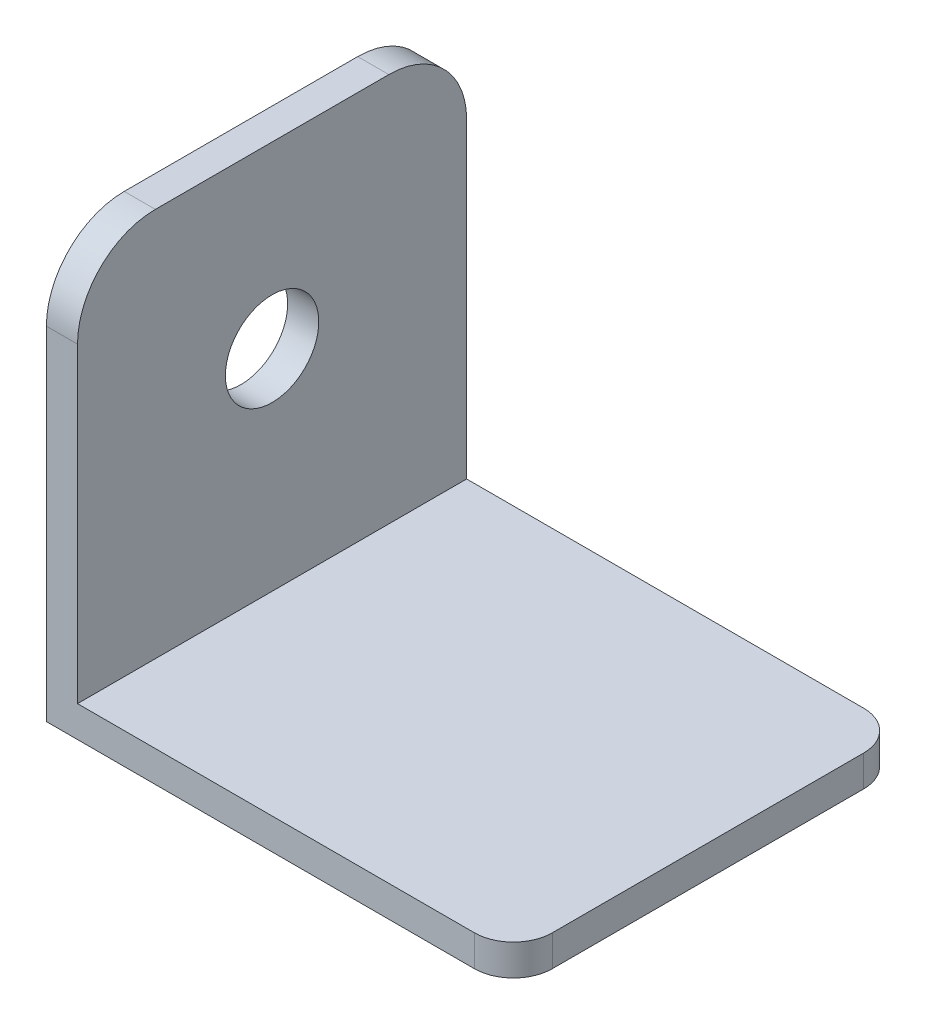
ISO-10303-21;
HEADER;
FILE_DESCRIPTION(('STEP AP214'),'2;1');
FILE_NAME('part.step','',(''),(''),'','','');
FILE_SCHEMA(('AUTOMOTIVE_DESIGN { 1 0 10303 214 1 1 1 1 }'));
ENDSEC;
DATA;
#1=APPLICATION_CONTEXT('core data for automotive mechanical design processes');
#2=APPLICATION_PROTOCOL_DEFINITION('international standard','automotive_design',2000,#1);
#3=PRODUCT_CONTEXT('',#1,'mechanical');
#4=PRODUCT('Part','Part','',(#3));
#5=PRODUCT_RELATED_PRODUCT_CATEGORY('part','',(#4));
#6=PRODUCT_DEFINITION_FORMATION('','',#4);
#7=PRODUCT_DEFINITION_CONTEXT('part definition',#1,'design');
#8=PRODUCT_DEFINITION('design','',#6,#7);
#9=PRODUCT_DEFINITION_SHAPE('','',#8);
#10=(LENGTH_UNIT() NAMED_UNIT(*) SI_UNIT(.MILLI.,.METRE.));
#11=(NAMED_UNIT(*) PLANE_ANGLE_UNIT() SI_UNIT($,.RADIAN.));
#12=(NAMED_UNIT(*) SI_UNIT($,.STERADIAN.) SOLID_ANGLE_UNIT());
#13=UNCERTAINTY_MEASURE_WITH_UNIT(LENGTH_MEASURE(1.E-05),#10,'distance_accuracy_value','');
#14=(GEOMETRIC_REPRESENTATION_CONTEXT(3) GLOBAL_UNCERTAINTY_ASSIGNED_CONTEXT((#13)) GLOBAL_UNIT_ASSIGNED_CONTEXT((#10,
#11,#12)) REPRESENTATION_CONTEXT('',''));
#15=CARTESIAN_POINT('',(0.,0.,0.));
#16=DIRECTION('',(0.,0.,1.));
#17=DIRECTION('',(1.,0.,0.));
#18=AXIS2_PLACEMENT_3D('',#15,#16,#17);
#19=CARTESIAN_POINT('',(0.,4.,0.));
#20=DIRECTION('',(0.,1.,0.));
#21=DIRECTION('',(0.,0.,1.));
#22=AXIS2_PLACEMENT_3D('',#19,#20,#21);
#23=PLANE('',#22);
#24=DIRECTION('',(0.,0.,-1.));
#25=VECTOR('',#24,1.);
#26=CARTESIAN_POINT('',(30.,4.,-25.));
#27=LINE('',#26,#25);
#28=CARTESIAN_POINT('',(30.,4.,20.));
#29=VERTEX_POINT('',#28);
#30=CARTESIAN_POINT('',(30.,4.,-20.));
#31=VERTEX_POINT('',#30);
#32=EDGE_CURVE('E132',#29,#31,#27,.T.);
#33=ORIENTED_EDGE('',*,*,#32,.T.);
#34=CARTESIAN_POINT('',(25.,4.,-20.));
#35=DIRECTION('',(0.,1.,0.));
#36=DIRECTION('',(0.,0.,1.));
#37=AXIS2_PLACEMENT_3D('',#34,#35,#36);
#38=CIRCLE('',#37,5.);
#39=CARTESIAN_POINT('',(25.,4.,-25.));
#40=VERTEX_POINT('',#39);
#41=EDGE_CURVE('E51',#31,#40,#38,.T.);
#42=ORIENTED_EDGE('',*,*,#41,.T.);
#43=DIRECTION('',(-1.,0.,0.));
#44=VECTOR('',#43,1.);
#45=CARTESIAN_POINT('',(-30.,4.,-25.));
#46=LINE('',#45,#44);
#47=CARTESIAN_POINT('',(-26.,4.,-25.));
#48=VERTEX_POINT('',#47);
#49=EDGE_CURVE('E122',#40,#48,#46,.T.);
#50=ORIENTED_EDGE('',*,*,#49,.T.);
#51=DIRECTION('',(0.,0.,1.));
#52=VECTOR('',#51,1.);
#53=CARTESIAN_POINT('',(-26.,4.,-25.));
#54=LINE('',#53,#52);
#55=CARTESIAN_POINT('',(-26.,4.,25.));
#56=VERTEX_POINT('',#55);
#57=EDGE_CURVE('E124',#48,#56,#54,.T.);
#58=ORIENTED_EDGE('',*,*,#57,.T.);
#59=DIRECTION('',(1.,0.,0.));
#60=VECTOR('',#59,1.);
#61=CARTESIAN_POINT('',(-30.,4.,25.));
#62=LINE('',#61,#60);
#63=CARTESIAN_POINT('',(25.,4.,25.));
#64=VERTEX_POINT('',#63);
#65=EDGE_CURVE('E131',#56,#64,#62,.T.);
#66=ORIENTED_EDGE('',*,*,#65,.T.);
#67=CARTESIAN_POINT('',(25.,4.,20.));
#68=DIRECTION('',(0.,1.,0.));
#69=DIRECTION('',(0.,0.,1.));
#70=AXIS2_PLACEMENT_3D('',#67,#68,#69);
#71=CIRCLE('',#70,5.);
#72=EDGE_CURVE('E231',#64,#29,#71,.T.);
#73=ORIENTED_EDGE('',*,*,#72,.T.);
#74=EDGE_LOOP('',(#33,#42,#50,#58,#66,#73));
#75=FACE_BOUND('',#74,.T.);
#76=ADVANCED_FACE('F42',(#75),#23,.T.);
#77=CARTESIAN_POINT('',(30.,4.,-25.));
#78=DIRECTION('',(-1.,0.,0.));
#79=DIRECTION('',(0.,0.,1.));
#80=AXIS2_PLACEMENT_3D('',#77,#78,#79);
#81=PLANE('',#80);
#82=DIRECTION('',(0.,0.,-1.));
#83=VECTOR('',#82,1.);
#84=CARTESIAN_POINT('',(30.,0.,-25.));
#85=LINE('',#84,#83);
#86=CARTESIAN_POINT('',(30.,0.,20.));
#87=VERTEX_POINT('',#86);
#88=CARTESIAN_POINT('',(30.,0.,-20.));
#89=VERTEX_POINT('',#88);
#90=EDGE_CURVE('E184',#87,#89,#85,.T.);
#91=ORIENTED_EDGE('',*,*,#90,.T.);
#92=DIRECTION('',(0.,-1.,0.));
#93=VECTOR('',#92,1.);
#94=CARTESIAN_POINT('',(30.,4.,-20.));
#95=LINE('',#94,#93);
#96=EDGE_CURVE('E64',#89,#31,#95,.F.);
#97=ORIENTED_EDGE('',*,*,#96,.T.);
#98=ORIENTED_EDGE('',*,*,#32,.F.);
#99=DIRECTION('',(0.,-1.,0.));
#100=VECTOR('',#99,1.);
#101=CARTESIAN_POINT('',(30.,4.,20.));
#102=LINE('',#101,#100);
#103=EDGE_CURVE('E225',#29,#87,#102,.T.);
#104=ORIENTED_EDGE('',*,*,#103,.T.);
#105=EDGE_LOOP('',(#91,#97,#98,#104));
#106=FACE_BOUND('',#105,.T.);
#107=ADVANCED_FACE('F253',(#106),#81,.F.);
#108=CARTESIAN_POINT('',(-30.,4.,-25.));
#109=DIRECTION('',(0.,0.,1.));
#110=DIRECTION('',(1.,0.,0.));
#111=AXIS2_PLACEMENT_3D('',#108,#109,#110);
#112=PLANE('',#111);
#113=ORIENTED_EDGE('',*,*,#49,.F.);
#114=DIRECTION('',(0.,-1.,0.));
#115=VECTOR('',#114,1.);
#116=CARTESIAN_POINT('',(25.,4.,-25.));
#117=LINE('',#116,#115);
#118=CARTESIAN_POINT('',(25.,0.,-25.));
#119=VERTEX_POINT('',#118);
#120=EDGE_CURVE('E216',#40,#119,#117,.T.);
#121=ORIENTED_EDGE('',*,*,#120,.T.);
#122=DIRECTION('',(-1.,0.,0.));
#123=VECTOR('',#122,1.);
#124=CARTESIAN_POINT('',(-30.,0.,-25.));
#125=LINE('',#124,#123);
#126=CARTESIAN_POINT('',(-30.,0.,-25.));
#127=VERTEX_POINT('',#126);
#128=EDGE_CURVE('E201',#119,#127,#125,.T.);
#129=ORIENTED_EDGE('',*,*,#128,.T.);
#130=DIRECTION('',(0.,-1.,0.));
#131=VECTOR('',#130,1.);
#132=CARTESIAN_POINT('',(-30.,4.,-25.));
#133=LINE('',#132,#131);
#134=CARTESIAN_POINT('',(-30.,44.,-25.));
#135=VERTEX_POINT('',#134);
#136=EDGE_CURVE('E212',#135,#127,#133,.T.);
#137=ORIENTED_EDGE('',*,*,#136,.F.);
#138=DIRECTION('',(-1.,0.,0.));
#139=VECTOR('',#138,1.);
#140=CARTESIAN_POINT('',(-26.,44.,-25.));
#141=LINE('',#140,#139);
#142=CARTESIAN_POINT('',(-26.,44.,-25.));
#143=VERTEX_POINT('',#142);
#144=EDGE_CURVE('E147',#143,#135,#141,.T.);
#145=ORIENTED_EDGE('',*,*,#144,.F.);
#146=DIRECTION('',(0.,-1.,0.));
#147=VECTOR('',#146,1.);
#148=CARTESIAN_POINT('',(-26.,4.,-25.));
#149=LINE('',#148,#147);
#150=EDGE_CURVE('E138',#143,#48,#149,.T.);
#151=ORIENTED_EDGE('',*,*,#150,.T.);
#152=EDGE_LOOP('',(#113,#121,#129,#137,#145,#151));
#153=FACE_BOUND('',#152,.T.);
#154=ADVANCED_FACE('F145',(#153),#112,.F.);
#155=CARTESIAN_POINT('',(-30.,4.,-25.));
#156=DIRECTION('',(1.,0.,0.));
#157=DIRECTION('',(0.,0.,-1.));
#158=AXIS2_PLACEMENT_3D('',#155,#156,#157);
#159=PLANE('',#158);
#160=DIRECTION('',(0.,0.,1.));
#161=VECTOR('',#160,1.);
#162=CARTESIAN_POINT('',(-30.,0.,-25.));
#163=LINE('',#162,#161);
#164=CARTESIAN_POINT('',(-30.,0.,25.));
#165=VERTEX_POINT('',#164);
#166=EDGE_CURVE('E204',#127,#165,#163,.T.);
#167=ORIENTED_EDGE('',*,*,#166,.T.);
#168=DIRECTION('',(0.,-1.,0.));
#169=VECTOR('',#168,1.);
#170=CARTESIAN_POINT('',(-30.,4.,25.));
#171=LINE('',#170,#169);
#172=CARTESIAN_POINT('',(-30.,44.,25.));
#173=VERTEX_POINT('',#172);
#174=EDGE_CURVE('E198',#173,#165,#171,.T.);
#175=ORIENTED_EDGE('',*,*,#174,.F.);
#176=CARTESIAN_POINT('',(-30.,44.,15.));
#177=DIRECTION('',(-1.,0.,0.));
#178=DIRECTION('',(0.,0.,-1.));
#179=AXIS2_PLACEMENT_3D('',#176,#177,#178);
#180=CIRCLE('',#179,10.);
#181=CARTESIAN_POINT('',(-30.,54.,15.));
#182=VERTEX_POINT('',#181);
#183=EDGE_CURVE('E174',#173,#182,#180,.T.);
#184=ORIENTED_EDGE('',*,*,#183,.T.);
#185=DIRECTION('',(0.,0.,-1.));
#186=VECTOR('',#185,1.);
#187=CARTESIAN_POINT('',(-30.,54.,-15.));
#188=LINE('',#187,#186);
#189=CARTESIAN_POINT('',(-30.,54.,-15.));
#190=VERTEX_POINT('',#189);
#191=EDGE_CURVE('E154',#182,#190,#188,.T.);
#192=ORIENTED_EDGE('',*,*,#191,.T.);
#193=CARTESIAN_POINT('',(-30.,44.,-15.));
#194=DIRECTION('',(-1.,0.,0.));
#195=DIRECTION('',(0.,0.,-1.));
#196=AXIS2_PLACEMENT_3D('',#193,#194,#195);
#197=CIRCLE('',#196,10.);
#198=EDGE_CURVE('E149',#190,#135,#197,.T.);
#199=ORIENTED_EDGE('',*,*,#198,.T.);
#200=ORIENTED_EDGE('',*,*,#136,.T.);
#201=EDGE_LOOP('',(#167,#175,#184,#192,#199,#200));
#202=FACE_BOUND('',#201,.T.);
#203=CARTESIAN_POINT('',(-30.,31.,0.));
#204=DIRECTION('',(-1.,0.,0.));
#205=DIRECTION('',(0.,0.,1.));
#206=AXIS2_PLACEMENT_3D('',#203,#204,#205);
#207=CIRCLE('',#206,6.);
#208=CARTESIAN_POINT('',(-30.,31.,6.));
#209=VERTEX_POINT('',#208);
#210=EDGE_CURVE('E157',#209,#209,#207,.T.);
#211=ORIENTED_EDGE('',*,*,#210,.F.);
#212=EDGE_LOOP('',(#211));
#213=FACE_BOUND('',#212,.T.);
#214=ADVANCED_FACE('F242',(#202,#213),#159,.F.);
#215=CARTESIAN_POINT('',(-30.,4.,25.));
#216=DIRECTION('',(0.,0.,-1.));
#217=DIRECTION('',(-1.,0.,0.));
#218=AXIS2_PLACEMENT_3D('',#215,#216,#217);
#219=PLANE('',#218);
#220=DIRECTION('',(1.,0.,0.));
#221=VECTOR('',#220,1.);
#222=CARTESIAN_POINT('',(-30.,0.,25.));
#223=LINE('',#222,#221);
#224=CARTESIAN_POINT('',(25.,0.,25.));
#225=VERTEX_POINT('',#224);
#226=EDGE_CURVE('E194',#165,#225,#223,.T.);
#227=ORIENTED_EDGE('',*,*,#226,.T.);
#228=DIRECTION('',(0.,-1.,0.));
#229=VECTOR('',#228,1.);
#230=CARTESIAN_POINT('',(25.,4.,25.));
#231=LINE('',#230,#229);
#232=EDGE_CURVE('E11',#225,#64,#231,.F.);
#233=ORIENTED_EDGE('',*,*,#232,.T.);
#234=ORIENTED_EDGE('',*,*,#65,.F.);
#235=DIRECTION('',(0.,1.,0.));
#236=VECTOR('',#235,1.);
#237=CARTESIAN_POINT('',(-26.,44.,25.));
#238=LINE('',#237,#236);
#239=CARTESIAN_POINT('',(-26.,44.,25.));
#240=VERTEX_POINT('',#239);
#241=EDGE_CURVE('E142',#56,#240,#238,.T.);
#242=ORIENTED_EDGE('',*,*,#241,.T.);
#243=DIRECTION('',(-1.,0.,0.));
#244=VECTOR('',#243,1.);
#245=CARTESIAN_POINT('',(-26.,44.,25.));
#246=LINE('',#245,#244);
#247=EDGE_CURVE('E173',#240,#173,#246,.T.);
#248=ORIENTED_EDGE('',*,*,#247,.T.);
#249=ORIENTED_EDGE('',*,*,#174,.T.);
#250=EDGE_LOOP('',(#227,#233,#234,#242,#248,#249));
#251=FACE_BOUND('',#250,.T.);
#252=ADVANCED_FACE('F244',(#251),#219,.F.);
#253=CARTESIAN_POINT('',(0.,0.,0.));
#254=DIRECTION('',(0.,1.,0.));
#255=DIRECTION('',(0.,0.,1.));
#256=AXIS2_PLACEMENT_3D('',#253,#254,#255);
#257=PLANE('',#256);
#258=ORIENTED_EDGE('',*,*,#128,.F.);
#259=CARTESIAN_POINT('',(25.,0.,-20.));
#260=DIRECTION('',(0.,1.,0.));
#261=DIRECTION('',(0.,0.,1.));
#262=AXIS2_PLACEMENT_3D('',#259,#260,#261);
#263=CIRCLE('',#262,5.);
#264=EDGE_CURVE('E222',#119,#89,#263,.F.);
#265=ORIENTED_EDGE('',*,*,#264,.T.);
#266=ORIENTED_EDGE('',*,*,#90,.F.);
#267=CARTESIAN_POINT('',(25.,0.,20.));
#268=DIRECTION('',(0.,1.,0.));
#269=DIRECTION('',(0.,0.,1.));
#270=AXIS2_PLACEMENT_3D('',#267,#268,#269);
#271=CIRCLE('',#270,5.);
#272=EDGE_CURVE('E219',#87,#225,#271,.F.);
#273=ORIENTED_EDGE('',*,*,#272,.T.);
#274=ORIENTED_EDGE('',*,*,#226,.F.);
#275=ORIENTED_EDGE('',*,*,#166,.F.);
#276=EDGE_LOOP('',(#258,#265,#266,#273,#274,#275));
#277=FACE_BOUND('',#276,.T.);
#278=ADVANCED_FACE('F251',(#277),#257,.F.);
#279=CARTESIAN_POINT('',(-26.,44.,-15.));
#280=DIRECTION('',(-1.,0.,0.));
#281=DIRECTION('',(0.,0.,1.));
#282=AXIS2_PLACEMENT_3D('',#279,#280,#281);
#283=CYLINDRICAL_SURFACE('',#282,10.);
#284=ORIENTED_EDGE('',*,*,#198,.F.);
#285=DIRECTION('',(-1.,0.,0.));
#286=VECTOR('',#285,1.);
#287=CARTESIAN_POINT('',(-26.,54.,-15.));
#288=LINE('',#287,#286);
#289=CARTESIAN_POINT('',(-26.,54.,-15.));
#290=VERTEX_POINT('',#289);
#291=EDGE_CURVE('E185',#290,#190,#288,.T.);
#292=ORIENTED_EDGE('',*,*,#291,.F.);
#293=CARTESIAN_POINT('',(-26.,44.,-15.));
#294=DIRECTION('',(-1.,0.,0.));
#295=DIRECTION('',(0.,0.,-1.));
#296=AXIS2_PLACEMENT_3D('',#293,#294,#295);
#297=CIRCLE('',#296,10.);
#298=EDGE_CURVE('E170',#290,#143,#297,.T.);
#299=ORIENTED_EDGE('',*,*,#298,.T.);
#300=ORIENTED_EDGE('',*,*,#144,.T.);
#301=EDGE_LOOP('',(#284,#292,#299,#300));
#302=FACE_BOUND('',#301,.T.);
#303=ADVANCED_FACE('F266',(#302),#283,.T.);
#304=CARTESIAN_POINT('',(-26.,54.,-15.));
#305=DIRECTION('',(0.,1.,0.));
#306=DIRECTION('',(0.,0.,1.));
#307=AXIS2_PLACEMENT_3D('',#304,#305,#306);
#308=PLANE('',#307);
#309=ORIENTED_EDGE('',*,*,#191,.F.);
#310=DIRECTION('',(-1.,0.,0.));
#311=VECTOR('',#310,1.);
#312=CARTESIAN_POINT('',(-26.,54.,15.));
#313=LINE('',#312,#311);
#314=CARTESIAN_POINT('',(-26.,54.,15.));
#315=VERTEX_POINT('',#314);
#316=EDGE_CURVE('E187',#315,#182,#313,.T.);
#317=ORIENTED_EDGE('',*,*,#316,.F.);
#318=DIRECTION('',(0.,0.,-1.));
#319=VECTOR('',#318,1.);
#320=CARTESIAN_POINT('',(-26.,54.,-15.));
#321=LINE('',#320,#319);
#322=EDGE_CURVE('E166',#315,#290,#321,.T.);
#323=ORIENTED_EDGE('',*,*,#322,.T.);
#324=ORIENTED_EDGE('',*,*,#291,.T.);
#325=EDGE_LOOP('',(#309,#317,#323,#324));
#326=FACE_BOUND('',#325,.T.);
#327=ADVANCED_FACE('F271',(#326),#308,.T.);
#328=CARTESIAN_POINT('',(-26.,44.,15.));
#329=DIRECTION('',(-1.,0.,0.));
#330=DIRECTION('',(0.,0.,1.));
#331=AXIS2_PLACEMENT_3D('',#328,#329,#330);
#332=CYLINDRICAL_SURFACE('',#331,10.);
#333=ORIENTED_EDGE('',*,*,#183,.F.);
#334=ORIENTED_EDGE('',*,*,#247,.F.);
#335=CARTESIAN_POINT('',(-26.,44.,15.));
#336=DIRECTION('',(-1.,0.,0.));
#337=DIRECTION('',(0.,0.,-1.));
#338=AXIS2_PLACEMENT_3D('',#335,#336,#337);
#339=CIRCLE('',#338,10.);
#340=EDGE_CURVE('E162',#240,#315,#339,.T.);
#341=ORIENTED_EDGE('',*,*,#340,.T.);
#342=ORIENTED_EDGE('',*,*,#316,.T.);
#343=EDGE_LOOP('',(#333,#334,#341,#342));
#344=FACE_BOUND('',#343,.T.);
#345=ADVANCED_FACE('F263',(#344),#332,.T.);
#346=CARTESIAN_POINT('',(-26.,44.,-15.));
#347=DIRECTION('',(1.,0.,0.));
#348=DIRECTION('',(0.,0.,-1.));
#349=AXIS2_PLACEMENT_3D('',#346,#347,#348);
#350=PLANE('',#349);
#351=CARTESIAN_POINT('',(-26.,31.,0.));
#352=DIRECTION('',(-1.,0.,0.));
#353=DIRECTION('',(0.,0.,1.));
#354=AXIS2_PLACEMENT_3D('',#351,#352,#353);
#355=CIRCLE('',#354,6.);
#356=CARTESIAN_POINT('',(-26.,31.,6.));
#357=VERTEX_POINT('',#356);
#358=EDGE_CURVE('E178',#357,#357,#355,.T.);
#359=ORIENTED_EDGE('',*,*,#358,.T.);
#360=EDGE_LOOP('',(#359));
#361=FACE_BOUND('',#360,.T.);
#362=ORIENTED_EDGE('',*,*,#150,.F.);
#363=ORIENTED_EDGE('',*,*,#298,.F.);
#364=ORIENTED_EDGE('',*,*,#322,.F.);
#365=ORIENTED_EDGE('',*,*,#340,.F.);
#366=ORIENTED_EDGE('',*,*,#241,.F.);
#367=ORIENTED_EDGE('',*,*,#57,.F.);
#368=EDGE_LOOP('',(#362,#363,#364,#365,#366,#367));
#369=FACE_BOUND('',#368,.T.);
#370=ADVANCED_FACE('F136',(#361,#369),#350,.T.);
#371=CARTESIAN_POINT('',(-26.,31.,0.));
#372=DIRECTION('',(-1.,0.,0.));
#373=DIRECTION('',(0.,0.,1.));
#374=AXIS2_PLACEMENT_3D('',#371,#372,#373);
#375=CYLINDRICAL_SURFACE('',#374,6.);
#376=ORIENTED_EDGE('',*,*,#358,.F.);
#377=EDGE_LOOP('',(#376));
#378=FACE_BOUND('',#377,.T.);
#379=ORIENTED_EDGE('',*,*,#210,.T.);
#380=EDGE_LOOP('',(#379));
#381=FACE_BOUND('',#380,.T.);
#382=ADVANCED_FACE('F240',(#378,#381),#375,.F.);
#383=CARTESIAN_POINT('',(25.,4.,-20.));
#384=DIRECTION('',(0.,-1.,0.));
#385=DIRECTION('',(0.,0.,-1.));
#386=AXIS2_PLACEMENT_3D('',#383,#384,#385);
#387=CYLINDRICAL_SURFACE('',#386,5.);
#388=ORIENTED_EDGE('',*,*,#41,.F.);
#389=ORIENTED_EDGE('',*,*,#96,.F.);
#390=ORIENTED_EDGE('',*,*,#264,.F.);
#391=ORIENTED_EDGE('',*,*,#120,.F.);
#392=EDGE_LOOP('',(#388,#389,#390,#391));
#393=FACE_BOUND('',#392,.T.);
#394=ADVANCED_FACE('F288',(#393),#387,.T.);
#395=CARTESIAN_POINT('',(25.,4.,20.));
#396=DIRECTION('',(0.,-1.,0.));
#397=DIRECTION('',(0.,0.,-1.));
#398=AXIS2_PLACEMENT_3D('',#395,#396,#397);
#399=CYLINDRICAL_SURFACE('',#398,5.);
#400=ORIENTED_EDGE('',*,*,#72,.F.);
#401=ORIENTED_EDGE('',*,*,#232,.F.);
#402=ORIENTED_EDGE('',*,*,#272,.F.);
#403=ORIENTED_EDGE('',*,*,#103,.F.);
#404=EDGE_LOOP('',(#400,#401,#402,#403));
#405=FACE_BOUND('',#404,.T.);
#406=ADVANCED_FACE('F44',(#405),#399,.T.);
#407=CLOSED_SHELL('',(#76,#107,#154,#214,#252,#278,#303,#327,#345,#370,#382,#394,#406));
#408=MANIFOLD_SOLID_BREP('B2',#407);
#409=ADVANCED_BREP_SHAPE_REPRESENTATION('',(#18,#408),#14);
#410=SHAPE_DEFINITION_REPRESENTATION(#9,#409);
ENDSEC;
END-ISO-10303-21;
